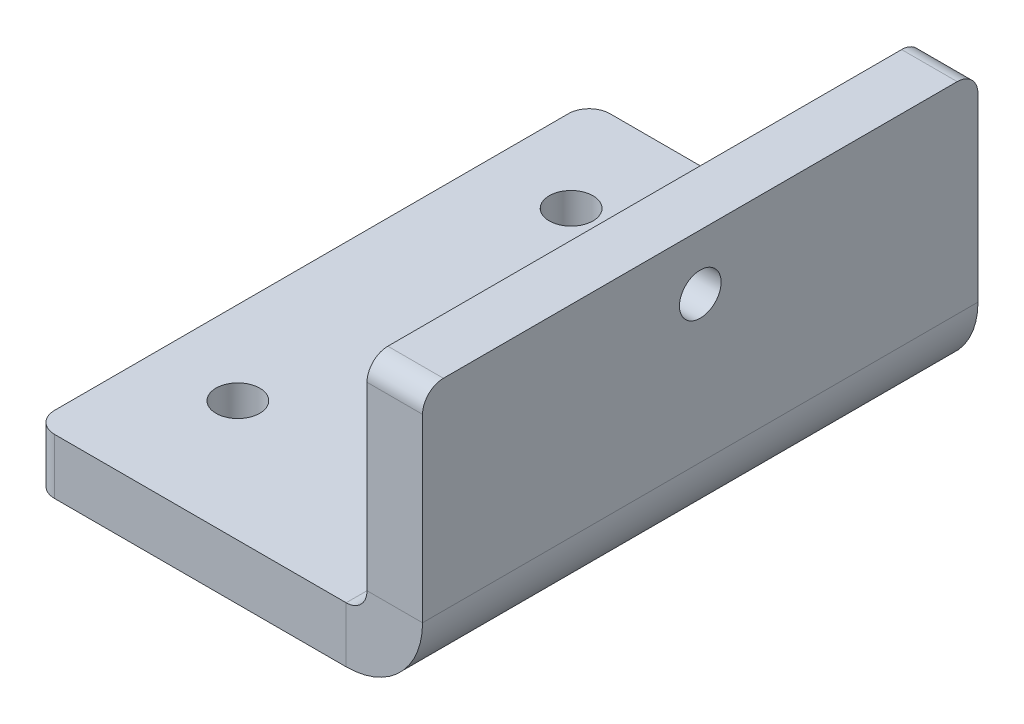
ISO-10303-21;
HEADER;
FILE_DESCRIPTION(('STEP AP214'),'2;1');
FILE_NAME('part.step','',(''),(''),'','','');
FILE_SCHEMA(('AUTOMOTIVE_DESIGN { 1 0 10303 214 1 1 1 1 }'));
ENDSEC;
DATA;
#1=APPLICATION_CONTEXT('core data for automotive mechanical design processes');
#2=APPLICATION_PROTOCOL_DEFINITION('international standard','automotive_design',2000,#1);
#3=PRODUCT_CONTEXT('',#1,'mechanical');
#4=PRODUCT('Part','Part','',(#3));
#5=PRODUCT_RELATED_PRODUCT_CATEGORY('part','',(#4));
#6=PRODUCT_DEFINITION_FORMATION('','',#4);
#7=PRODUCT_DEFINITION_CONTEXT('part definition',#1,'design');
#8=PRODUCT_DEFINITION('design','',#6,#7);
#9=PRODUCT_DEFINITION_SHAPE('','',#8);
#10=(LENGTH_UNIT() NAMED_UNIT(*) SI_UNIT(.MILLI.,.METRE.));
#11=(NAMED_UNIT(*) PLANE_ANGLE_UNIT() SI_UNIT($,.RADIAN.));
#12=(NAMED_UNIT(*) SI_UNIT($,.STERADIAN.) SOLID_ANGLE_UNIT());
#13=UNCERTAINTY_MEASURE_WITH_UNIT(LENGTH_MEASURE(1.E-05),#10,'distance_accuracy_value','');
#14=(GEOMETRIC_REPRESENTATION_CONTEXT(3) GLOBAL_UNCERTAINTY_ASSIGNED_CONTEXT((#13)) GLOBAL_UNIT_ASSIGNED_CONTEXT((#10,
#11,#12)) REPRESENTATION_CONTEXT('',''));
#15=CARTESIAN_POINT('',(0.,0.,0.));
#16=DIRECTION('',(0.,0.,1.));
#17=DIRECTION('',(1.,0.,0.));
#18=AXIS2_PLACEMENT_3D('',#15,#16,#17);
#19=CARTESIAN_POINT('',(0.,3.,40.));
#20=DIRECTION('',(0.,0.,1.));
#21=DIRECTION('',(1.,0.,0.));
#22=AXIS2_PLACEMENT_3D('',#19,#20,#21);
#23=PLANE('',#22);
#24=DIRECTION('',(1.,0.,0.));
#25=VECTOR('',#24,1.);
#26=CARTESIAN_POINT('',(0.,3.,40.));
#27=LINE('',#26,#25);
#28=CARTESIAN_POINT('',(0.,3.,40.));
#29=VERTEX_POINT('',#28);
#30=CARTESIAN_POINT('',(8.,3.,40.));
#31=VERTEX_POINT('',#30);
#32=EDGE_CURVE('E132',#29,#31,#27,.T.);
#33=ORIENTED_EDGE('',*,*,#32,.F.);
#34=CARTESIAN_POINT('',(-3.,3.,40.));
#35=DIRECTION('',(0.,0.,-1.));
#36=DIRECTION('',(-1.,0.,0.));
#37=AXIS2_PLACEMENT_3D('',#34,#35,#36);
#38=CIRCLE('',#37,3.);
#39=CARTESIAN_POINT('',(-3.,0.,40.));
#40=VERTEX_POINT('',#39);
#41=EDGE_CURVE('E136',#40,#29,#38,.F.);
#42=ORIENTED_EDGE('',*,*,#41,.F.);
#43=DIRECTION('',(0.,1.,0.));
#44=VECTOR('',#43,1.);
#45=CARTESIAN_POINT('',(-3.,-8.,40.));
#46=LINE('',#45,#44);
#47=CARTESIAN_POINT('',(-3.,-8.,40.));
#48=VERTEX_POINT('',#47);
#49=EDGE_CURVE('E141',#48,#40,#46,.T.);
#50=ORIENTED_EDGE('',*,*,#49,.F.);
#51=CARTESIAN_POINT('',(-3.,3.,40.));
#52=DIRECTION('',(0.,0.,1.));
#53=DIRECTION('',(1.,0.,0.));
#54=AXIS2_PLACEMENT_3D('',#51,#52,#53);
#55=CIRCLE('',#54,11.);
#56=EDGE_CURVE('E138',#48,#31,#55,.T.);
#57=ORIENTED_EDGE('',*,*,#56,.T.);
#58=EDGE_LOOP('',(#33,#42,#50,#57));
#59=FACE_BOUND('',#58,.T.);
#60=ADVANCED_FACE('F39',(#59),#23,.T.);
#61=CARTESIAN_POINT('',(-3.,-8.,40.));
#62=DIRECTION('',(0.,0.,1.));
#63=DIRECTION('',(1.,0.,0.));
#64=AXIS2_PLACEMENT_3D('',#61,#62,#63);
#65=PLANE('',#64);
#66=DIRECTION('',(0.,1.,0.));
#67=VECTOR('',#66,1.);
#68=CARTESIAN_POINT('',(8.,0.,40.));
#69=LINE('',#68,#67);
#70=CARTESIAN_POINT('',(8.,29.,40.));
#71=VERTEX_POINT('',#70);
#72=EDGE_CURVE('E159',#31,#71,#69,.T.);
#73=ORIENTED_EDGE('',*,*,#72,.T.);
#74=DIRECTION('',(1.,0.,0.));
#75=VECTOR('',#74,1.);
#76=CARTESIAN_POINT('',(-3.,29.,40.));
#77=LINE('',#76,#75);
#78=CARTESIAN_POINT('',(0.,29.,40.));
#79=VERTEX_POINT('',#78);
#80=EDGE_CURVE('E11',#71,#79,#77,.F.);
#81=ORIENTED_EDGE('',*,*,#80,.T.);
#82=DIRECTION('',(0.,1.,0.));
#83=VECTOR('',#82,1.);
#84=CARTESIAN_POINT('',(0.,0.,40.));
#85=LINE('',#84,#83);
#86=EDGE_CURVE('E148',#29,#79,#85,.T.);
#87=ORIENTED_EDGE('',*,*,#86,.F.);
#88=ORIENTED_EDGE('',*,*,#32,.T.);
#89=EDGE_LOOP('',(#73,#81,#87,#88));
#90=FACE_BOUND('',#89,.T.);
#91=ADVANCED_FACE('F158',(#90),#65,.T.);
#92=CARTESIAN_POINT('',(-3.,0.,-40.));
#93=DIRECTION('',(0.,0.,-1.));
#94=DIRECTION('',(-1.,0.,0.));
#95=AXIS2_PLACEMENT_3D('',#92,#93,#94);
#96=PLANE('',#95);
#97=DIRECTION('',(0.,-1.,0.));
#98=VECTOR('',#97,1.);
#99=CARTESIAN_POINT('',(-3.,0.,-40.));
#100=LINE('',#99,#98);
#101=CARTESIAN_POINT('',(-3.,0.,-40.));
#102=VERTEX_POINT('',#101);
#103=CARTESIAN_POINT('',(-3.,-8.,-40.));
#104=VERTEX_POINT('',#103);
#105=EDGE_CURVE('E203',#102,#104,#100,.T.);
#106=ORIENTED_EDGE('',*,*,#105,.F.);
#107=CARTESIAN_POINT('',(-3.,3.,-40.));
#108=DIRECTION('',(0.,0.,-1.));
#109=DIRECTION('',(-1.,0.,0.));
#110=AXIS2_PLACEMENT_3D('',#107,#108,#109);
#111=CIRCLE('',#110,3.);
#112=CARTESIAN_POINT('',(0.,3.,-40.));
#113=VERTEX_POINT('',#112);
#114=EDGE_CURVE('E177',#102,#113,#111,.F.);
#115=ORIENTED_EDGE('',*,*,#114,.T.);
#116=DIRECTION('',(-1.,0.,0.));
#117=VECTOR('',#116,1.);
#118=CARTESIAN_POINT('',(8.,3.,-40.));
#119=LINE('',#118,#117);
#120=CARTESIAN_POINT('',(8.,3.,-40.));
#121=VERTEX_POINT('',#120);
#122=EDGE_CURVE('E201',#121,#113,#119,.T.);
#123=ORIENTED_EDGE('',*,*,#122,.F.);
#124=CARTESIAN_POINT('',(-3.,3.,-40.));
#125=DIRECTION('',(0.,0.,1.));
#126=DIRECTION('',(1.,0.,0.));
#127=AXIS2_PLACEMENT_3D('',#124,#125,#126);
#128=CIRCLE('',#127,11.);
#129=EDGE_CURVE('E183',#104,#121,#128,.T.);
#130=ORIENTED_EDGE('',*,*,#129,.F.);
#131=EDGE_LOOP('',(#106,#115,#123,#130));
#132=FACE_BOUND('',#131,.T.);
#133=ADVANCED_FACE('F271',(#132),#96,.T.);
#134=CARTESIAN_POINT('',(8.,3.,-40.));
#135=DIRECTION('',(0.,0.,-1.));
#136=DIRECTION('',(-1.,0.,0.));
#137=AXIS2_PLACEMENT_3D('',#134,#135,#136);
#138=PLANE('',#137);
#139=DIRECTION('',(1.,0.,0.));
#140=VECTOR('',#139,1.);
#141=CARTESIAN_POINT('',(-48.,-8.,-40.));
#142=LINE('',#141,#140);
#143=CARTESIAN_POINT('',(-45.,-8.,-40.));
#144=VERTEX_POINT('',#143);
#145=EDGE_CURVE('E181',#144,#104,#142,.T.);
#146=ORIENTED_EDGE('',*,*,#145,.F.);
#147=DIRECTION('',(0.,1.,0.));
#148=VECTOR('',#147,1.);
#149=CARTESIAN_POINT('',(-45.,3.,-40.));
#150=LINE('',#149,#148);
#151=CARTESIAN_POINT('',(-45.,0.,-40.));
#152=VERTEX_POINT('',#151);
#153=EDGE_CURVE('E222',#144,#152,#150,.T.);
#154=ORIENTED_EDGE('',*,*,#153,.T.);
#155=DIRECTION('',(1.,0.,0.));
#156=VECTOR('',#155,1.);
#157=CARTESIAN_POINT('',(-48.,0.,-40.));
#158=LINE('',#157,#156);
#159=EDGE_CURVE('E179',#152,#102,#158,.T.);
#160=ORIENTED_EDGE('',*,*,#159,.T.);
#161=ORIENTED_EDGE('',*,*,#105,.T.);
#162=EDGE_LOOP('',(#146,#154,#160,#161));
#163=FACE_BOUND('',#162,.T.);
#164=ADVANCED_FACE('F283',(#163),#138,.T.);
#165=CARTESIAN_POINT('',(8.,0.,40.));
#166=DIRECTION('',(-1.,0.,0.));
#167=DIRECTION('',(0.,0.,1.));
#168=AXIS2_PLACEMENT_3D('',#165,#166,#167);
#169=PLANE('',#168);
#170=CARTESIAN_POINT('',(8.,24.,0.));
#171=DIRECTION('',(-1.,0.,0.));
#172=DIRECTION('',(0.,0.,1.));
#173=AXIS2_PLACEMENT_3D('',#170,#171,#172);
#174=CIRCLE('',#173,3.);
#175=CARTESIAN_POINT('',(8.,24.,3.));
#176=VERTEX_POINT('',#175);
#177=EDGE_CURVE('E250',#176,#176,#174,.T.);
#178=ORIENTED_EDGE('',*,*,#177,.T.);
#179=EDGE_LOOP('',(#178));
#180=FACE_BOUND('',#179,.T.);
#181=DIRECTION('',(0.,1.,0.));
#182=VECTOR('',#181,1.);
#183=CARTESIAN_POINT('',(8.,0.,-40.));
#184=LINE('',#183,#182);
#185=CARTESIAN_POINT('',(8.,29.,-40.));
#186=VERTEX_POINT('',#185);
#187=EDGE_CURVE('E173',#121,#186,#184,.T.);
#188=ORIENTED_EDGE('',*,*,#187,.T.);
#189=CARTESIAN_POINT('',(8.,29.,-37.));
#190=DIRECTION('',(-1.,0.,0.));
#191=DIRECTION('',(0.,0.,1.));
#192=AXIS2_PLACEMENT_3D('',#189,#190,#191);
#193=CIRCLE('',#192,3.);
#194=CARTESIAN_POINT('',(8.,32.,-37.));
#195=VERTEX_POINT('',#194);
#196=EDGE_CURVE('E230',#186,#195,#193,.F.);
#197=ORIENTED_EDGE('',*,*,#196,.T.);
#198=DIRECTION('',(0.,0.,-1.));
#199=VECTOR('',#198,1.);
#200=CARTESIAN_POINT('',(8.,32.,40.));
#201=LINE('',#200,#199);
#202=CARTESIAN_POINT('',(8.,32.,37.));
#203=VERTEX_POINT('',#202);
#204=EDGE_CURVE('E199',#203,#195,#201,.T.);
#205=ORIENTED_EDGE('',*,*,#204,.F.);
#206=CARTESIAN_POINT('',(8.,29.,37.));
#207=DIRECTION('',(-1.,0.,0.));
#208=DIRECTION('',(0.,0.,1.));
#209=AXIS2_PLACEMENT_3D('',#206,#207,#208);
#210=CIRCLE('',#209,3.);
#211=EDGE_CURVE('E228',#203,#71,#210,.F.);
#212=ORIENTED_EDGE('',*,*,#211,.T.);
#213=ORIENTED_EDGE('',*,*,#72,.F.);
#214=DIRECTION('',(0.,0.,-1.));
#215=VECTOR('',#214,1.);
#216=CARTESIAN_POINT('',(8.,3.,40.));
#217=LINE('',#216,#215);
#218=EDGE_CURVE('E172',#31,#121,#217,.T.);
#219=ORIENTED_EDGE('',*,*,#218,.T.);
#220=EDGE_LOOP('',(#188,#197,#205,#212,#213,#219));
#221=FACE_BOUND('',#220,.T.);
#222=ADVANCED_FACE('F261',(#180,#221),#169,.F.);
#223=CARTESIAN_POINT('',(0.,32.,40.));
#224=DIRECTION('',(0.,1.,0.));
#225=DIRECTION('',(0.,0.,1.));
#226=AXIS2_PLACEMENT_3D('',#223,#224,#225);
#227=PLANE('',#226);
#228=ORIENTED_EDGE('',*,*,#204,.T.);
#229=DIRECTION('',(1.,0.,0.));
#230=VECTOR('',#229,1.);
#231=CARTESIAN_POINT('',(0.,32.,-37.));
#232=LINE('',#231,#230);
#233=CARTESIAN_POINT('',(0.,32.,-37.));
#234=VERTEX_POINT('',#233);
#235=EDGE_CURVE('E62',#195,#234,#232,.F.);
#236=ORIENTED_EDGE('',*,*,#235,.T.);
#237=DIRECTION('',(0.,0.,-1.));
#238=VECTOR('',#237,1.);
#239=CARTESIAN_POINT('',(0.,32.,40.));
#240=LINE('',#239,#238);
#241=CARTESIAN_POINT('',(0.,32.,37.));
#242=VERTEX_POINT('',#241);
#243=EDGE_CURVE('E155',#242,#234,#240,.T.);
#244=ORIENTED_EDGE('',*,*,#243,.F.);
#245=DIRECTION('',(1.,0.,0.));
#246=VECTOR('',#245,1.);
#247=CARTESIAN_POINT('',(0.,32.,37.));
#248=LINE('',#247,#246);
#249=EDGE_CURVE('E232',#242,#203,#248,.T.);
#250=ORIENTED_EDGE('',*,*,#249,.T.);
#251=EDGE_LOOP('',(#228,#236,#244,#250));
#252=FACE_BOUND('',#251,.T.);
#253=ADVANCED_FACE('F259',(#252),#227,.T.);
#254=CARTESIAN_POINT('',(0.,0.,40.));
#255=DIRECTION('',(-1.,0.,0.));
#256=DIRECTION('',(0.,0.,1.));
#257=AXIS2_PLACEMENT_3D('',#254,#255,#256);
#258=PLANE('',#257);
#259=CARTESIAN_POINT('',(0.,24.,0.));
#260=DIRECTION('',(-1.,0.,0.));
#261=DIRECTION('',(0.,0.,1.));
#262=AXIS2_PLACEMENT_3D('',#259,#260,#261);
#263=CIRCLE('',#262,3.);
#264=CARTESIAN_POINT('',(0.,24.,3.));
#265=VERTEX_POINT('',#264);
#266=EDGE_CURVE('E358',#265,#265,#263,.T.);
#267=ORIENTED_EDGE('',*,*,#266,.F.);
#268=EDGE_LOOP('',(#267));
#269=FACE_BOUND('',#268,.T.);
#270=ORIENTED_EDGE('',*,*,#243,.T.);
#271=CARTESIAN_POINT('',(0.,29.,-37.));
#272=DIRECTION('',(-1.,0.,0.));
#273=DIRECTION('',(0.,0.,1.));
#274=AXIS2_PLACEMENT_3D('',#271,#272,#273);
#275=CIRCLE('',#274,3.);
#276=CARTESIAN_POINT('',(0.,29.,-40.));
#277=VERTEX_POINT('',#276);
#278=EDGE_CURVE('E48',#234,#277,#275,.T.);
#279=ORIENTED_EDGE('',*,*,#278,.T.);
#280=DIRECTION('',(0.,1.,0.));
#281=VECTOR('',#280,1.);
#282=CARTESIAN_POINT('',(0.,0.,-40.));
#283=LINE('',#282,#281);
#284=EDGE_CURVE('E151',#113,#277,#283,.T.);
#285=ORIENTED_EDGE('',*,*,#284,.F.);
#286=DIRECTION('',(0.,0.,-1.));
#287=VECTOR('',#286,1.);
#288=CARTESIAN_POINT('',(0.,3.,40.));
#289=LINE('',#288,#287);
#290=EDGE_CURVE('E146',#29,#113,#289,.T.);
#291=ORIENTED_EDGE('',*,*,#290,.F.);
#292=ORIENTED_EDGE('',*,*,#86,.T.);
#293=CARTESIAN_POINT('',(0.,29.,37.));
#294=DIRECTION('',(-1.,0.,0.));
#295=DIRECTION('',(0.,0.,1.));
#296=AXIS2_PLACEMENT_3D('',#293,#294,#295);
#297=CIRCLE('',#296,3.);
#298=EDGE_CURVE('E236',#79,#242,#297,.T.);
#299=ORIENTED_EDGE('',*,*,#298,.T.);
#300=EDGE_LOOP('',(#270,#279,#285,#291,#292,#299));
#301=FACE_BOUND('',#300,.T.);
#302=ADVANCED_FACE('F147',(#269,#301),#258,.T.);
#303=CARTESIAN_POINT('',(-3.,3.,40.));
#304=DIRECTION('',(0.,0.,-1.));
#305=DIRECTION('',(-1.,0.,0.));
#306=AXIS2_PLACEMENT_3D('',#303,#304,#305);
#307=CYLINDRICAL_SURFACE('',#306,3.);
#308=ORIENTED_EDGE('',*,*,#114,.F.);
#309=DIRECTION('',(0.,0.,-1.));
#310=VECTOR('',#309,1.);
#311=CARTESIAN_POINT('',(-3.,0.,40.));
#312=LINE('',#311,#310);
#313=EDGE_CURVE('E156',#40,#102,#312,.T.);
#314=ORIENTED_EDGE('',*,*,#313,.F.);
#315=ORIENTED_EDGE('',*,*,#41,.T.);
#316=ORIENTED_EDGE('',*,*,#290,.T.);
#317=EDGE_LOOP('',(#308,#314,#315,#316));
#318=FACE_BOUND('',#317,.T.);
#319=ADVANCED_FACE('F162',(#318),#307,.F.);
#320=CARTESIAN_POINT('',(-48.,0.,40.));
#321=DIRECTION('',(0.,1.,0.));
#322=DIRECTION('',(0.,0.,1.));
#323=AXIS2_PLACEMENT_3D('',#320,#321,#322);
#324=PLANE('',#323);
#325=CARTESIAN_POINT('',(-36.,0.,-25.3976815907645));
#326=DIRECTION('',(0.,1.,0.));
#327=DIRECTION('',(0.,0.,1.));
#328=AXIS2_PLACEMENT_3D('',#325,#326,#327);
#329=CIRCLE('',#328,3.15);
#330=CARTESIAN_POINT('',(-36.,0.,-22.2476815907645));
#331=VERTEX_POINT('',#330);
#332=EDGE_CURVE('E240',#331,#331,#329,.T.);
#333=ORIENTED_EDGE('',*,*,#332,.F.);
#334=EDGE_LOOP('',(#333));
#335=FACE_BOUND('',#334,.T.);
#336=CARTESIAN_POINT('',(-36.,0.,22.6023184092355));
#337=DIRECTION('',(0.,1.,0.));
#338=DIRECTION('',(0.,0.,-1.));
#339=AXIS2_PLACEMENT_3D('',#336,#337,#338);
#340=CIRCLE('',#339,3.15);
#341=CARTESIAN_POINT('',(-36.,0.,19.4523184092355));
#342=VERTEX_POINT('',#341);
#343=EDGE_CURVE('E245',#342,#342,#340,.T.);
#344=ORIENTED_EDGE('',*,*,#343,.F.);
#345=EDGE_LOOP('',(#344));
#346=FACE_BOUND('',#345,.T.);
#347=DIRECTION('',(0.,0.,-1.));
#348=VECTOR('',#347,1.);
#349=CARTESIAN_POINT('',(-48.,0.,40.));
#350=LINE('',#349,#348);
#351=CARTESIAN_POINT('',(-48.,0.,37.));
#352=VERTEX_POINT('',#351);
#353=CARTESIAN_POINT('',(-48.,0.,-37.));
#354=VERTEX_POINT('',#353);
#355=EDGE_CURVE('E194',#352,#354,#350,.T.);
#356=ORIENTED_EDGE('',*,*,#355,.F.);
#357=CARTESIAN_POINT('',(-45.,0.,37.));
#358=DIRECTION('',(0.,1.,0.));
#359=DIRECTION('',(0.,0.,1.));
#360=AXIS2_PLACEMENT_3D('',#357,#358,#359);
#361=CIRCLE('',#360,3.);
#362=CARTESIAN_POINT('',(-45.,0.,40.));
#363=VERTEX_POINT('',#362);
#364=EDGE_CURVE('E214',#352,#363,#361,.T.);
#365=ORIENTED_EDGE('',*,*,#364,.T.);
#366=DIRECTION('',(1.,0.,0.));
#367=VECTOR('',#366,1.);
#368=CARTESIAN_POINT('',(-48.,0.,40.));
#369=LINE('',#368,#367);
#370=EDGE_CURVE('E164',#363,#40,#369,.T.);
#371=ORIENTED_EDGE('',*,*,#370,.T.);
#372=ORIENTED_EDGE('',*,*,#313,.T.);
#373=ORIENTED_EDGE('',*,*,#159,.F.);
#374=CARTESIAN_POINT('',(-45.,0.,-37.));
#375=DIRECTION('',(0.,1.,0.));
#376=DIRECTION('',(0.,0.,1.));
#377=AXIS2_PLACEMENT_3D('',#374,#375,#376);
#378=CIRCLE('',#377,3.);
#379=EDGE_CURVE('E212',#152,#354,#378,.T.);
#380=ORIENTED_EDGE('',*,*,#379,.T.);
#381=EDGE_LOOP('',(#356,#365,#371,#372,#373,#380));
#382=FACE_BOUND('',#381,.T.);
#383=ADVANCED_FACE('F287',(#335,#346,#382),#324,.T.);
#384=CARTESIAN_POINT('',(-48.,-8.,40.));
#385=DIRECTION('',(-1.,0.,0.));
#386=DIRECTION('',(0.,0.,1.));
#387=AXIS2_PLACEMENT_3D('',#384,#385,#386);
#388=PLANE('',#387);
#389=DIRECTION('',(0.,0.,-1.));
#390=VECTOR('',#389,1.);
#391=CARTESIAN_POINT('',(-48.,-8.,40.));
#392=LINE('',#391,#390);
#393=CARTESIAN_POINT('',(-48.,-8.,37.));
#394=VERTEX_POINT('',#393);
#395=CARTESIAN_POINT('',(-48.,-8.,-37.));
#396=VERTEX_POINT('',#395);
#397=EDGE_CURVE('E191',#394,#396,#392,.T.);
#398=ORIENTED_EDGE('',*,*,#397,.F.);
#399=DIRECTION('',(0.,1.,0.));
#400=VECTOR('',#399,1.);
#401=CARTESIAN_POINT('',(-48.,0.,37.));
#402=LINE('',#401,#400);
#403=EDGE_CURVE('E209',#394,#352,#402,.T.);
#404=ORIENTED_EDGE('',*,*,#403,.T.);
#405=ORIENTED_EDGE('',*,*,#355,.T.);
#406=DIRECTION('',(0.,1.,0.));
#407=VECTOR('',#406,1.);
#408=CARTESIAN_POINT('',(-48.,-8.,-37.));
#409=LINE('',#408,#407);
#410=EDGE_CURVE('E140',#354,#396,#409,.F.);
#411=ORIENTED_EDGE('',*,*,#410,.T.);
#412=EDGE_LOOP('',(#398,#404,#405,#411));
#413=FACE_BOUND('',#412,.T.);
#414=ADVANCED_FACE('F297',(#413),#388,.T.);
#415=CARTESIAN_POINT('',(-48.,-8.,40.));
#416=DIRECTION('',(0.,1.,0.));
#417=DIRECTION('',(0.,0.,1.));
#418=AXIS2_PLACEMENT_3D('',#415,#416,#417);
#419=PLANE('',#418);
#420=CARTESIAN_POINT('',(-36.,-8.,-25.3976815907645));
#421=DIRECTION('',(0.,1.,0.));
#422=DIRECTION('',(0.,0.,1.));
#423=AXIS2_PLACEMENT_3D('',#420,#421,#422);
#424=CIRCLE('',#423,3.15);
#425=CARTESIAN_POINT('',(-36.,-8.,-22.2476815907645));
#426=VERTEX_POINT('',#425);
#427=EDGE_CURVE('E43',#426,#426,#424,.T.);
#428=ORIENTED_EDGE('',*,*,#427,.T.);
#429=EDGE_LOOP('',(#428));
#430=FACE_BOUND('',#429,.T.);
#431=CARTESIAN_POINT('',(-36.,-8.,22.6023184092355));
#432=DIRECTION('',(0.,1.,0.));
#433=DIRECTION('',(0.,0.,1.));
#434=AXIS2_PLACEMENT_3D('',#431,#432,#433);
#435=CIRCLE('',#434,3.15);
#436=CARTESIAN_POINT('',(-36.,-8.,25.7523184092355));
#437=VERTEX_POINT('',#436);
#438=EDGE_CURVE('E238',#437,#437,#435,.T.);
#439=ORIENTED_EDGE('',*,*,#438,.T.);
#440=EDGE_LOOP('',(#439));
#441=FACE_BOUND('',#440,.T.);
#442=DIRECTION('',(1.,0.,0.));
#443=VECTOR('',#442,1.);
#444=CARTESIAN_POINT('',(-48.,-8.,40.));
#445=LINE('',#444,#443);
#446=CARTESIAN_POINT('',(-45.,-8.,40.));
#447=VERTEX_POINT('',#446);
#448=EDGE_CURVE('E166',#447,#48,#445,.T.);
#449=ORIENTED_EDGE('',*,*,#448,.F.);
#450=CARTESIAN_POINT('',(-45.,-8.,37.));
#451=DIRECTION('',(0.,1.,0.));
#452=DIRECTION('',(0.,0.,1.));
#453=AXIS2_PLACEMENT_3D('',#450,#451,#452);
#454=CIRCLE('',#453,3.);
#455=EDGE_CURVE('E220',#447,#394,#454,.F.);
#456=ORIENTED_EDGE('',*,*,#455,.T.);
#457=ORIENTED_EDGE('',*,*,#397,.T.);
#458=CARTESIAN_POINT('',(-45.,-8.,-37.));
#459=DIRECTION('',(0.,1.,0.));
#460=DIRECTION('',(0.,0.,1.));
#461=AXIS2_PLACEMENT_3D('',#458,#459,#460);
#462=CIRCLE('',#461,3.);
#463=EDGE_CURVE('E218',#396,#144,#462,.F.);
#464=ORIENTED_EDGE('',*,*,#463,.T.);
#465=ORIENTED_EDGE('',*,*,#145,.T.);
#466=DIRECTION('',(0.,0.,-1.));
#467=VECTOR('',#466,1.);
#468=CARTESIAN_POINT('',(-3.,-8.,40.));
#469=LINE('',#468,#467);
#470=EDGE_CURVE('E188',#48,#104,#469,.T.);
#471=ORIENTED_EDGE('',*,*,#470,.F.);
#472=EDGE_LOOP('',(#449,#456,#457,#464,#465,#471));
#473=FACE_BOUND('',#472,.T.);
#474=ADVANCED_FACE('F277',(#430,#441,#473),#419,.F.);
#475=CARTESIAN_POINT('',(-3.,3.,40.));
#476=DIRECTION('',(0.,0.,-1.));
#477=DIRECTION('',(-1.,0.,0.));
#478=AXIS2_PLACEMENT_3D('',#475,#476,#477);
#479=CYLINDRICAL_SURFACE('',#478,11.);
#480=ORIENTED_EDGE('',*,*,#129,.T.);
#481=ORIENTED_EDGE('',*,*,#218,.F.);
#482=ORIENTED_EDGE('',*,*,#56,.F.);
#483=ORIENTED_EDGE('',*,*,#470,.T.);
#484=EDGE_LOOP('',(#480,#481,#482,#483));
#485=FACE_BOUND('',#484,.T.);
#486=ADVANCED_FACE('F273',(#485),#479,.T.);
#487=CARTESIAN_POINT('',(-3.,3.,40.));
#488=DIRECTION('',(0.,0.,-1.));
#489=DIRECTION('',(-1.,0.,0.));
#490=AXIS2_PLACEMENT_3D('',#487,#488,#489);
#491=PLANE('',#490);
#492=ORIENTED_EDGE('',*,*,#370,.F.);
#493=DIRECTION('',(0.,1.,0.));
#494=VECTOR('',#493,1.);
#495=CARTESIAN_POINT('',(-45.,-8.,40.));
#496=LINE('',#495,#494);
#497=EDGE_CURVE('E216',#363,#447,#496,.F.);
#498=ORIENTED_EDGE('',*,*,#497,.T.);
#499=ORIENTED_EDGE('',*,*,#448,.T.);
#500=ORIENTED_EDGE('',*,*,#49,.T.);
#501=EDGE_LOOP('',(#492,#498,#499,#500));
#502=FACE_BOUND('',#501,.T.);
#503=ADVANCED_FACE('F291',(#502),#491,.F.);
#504=CARTESIAN_POINT('',(-3.,3.,-40.));
#505=DIRECTION('',(0.,0.,-1.));
#506=DIRECTION('',(-1.,0.,0.));
#507=AXIS2_PLACEMENT_3D('',#504,#505,#506);
#508=PLANE('',#507);
#509=ORIENTED_EDGE('',*,*,#284,.T.);
#510=DIRECTION('',(1.,0.,0.));
#511=VECTOR('',#510,1.);
#512=CARTESIAN_POINT('',(-3.,29.,-40.));
#513=LINE('',#512,#511);
#514=EDGE_CURVE('E225',#277,#186,#513,.T.);
#515=ORIENTED_EDGE('',*,*,#514,.T.);
#516=ORIENTED_EDGE('',*,*,#187,.F.);
#517=ORIENTED_EDGE('',*,*,#122,.T.);
#518=EDGE_LOOP('',(#509,#515,#516,#517));
#519=FACE_BOUND('',#518,.T.);
#520=ADVANCED_FACE('F267',(#519),#508,.T.);
#521=CARTESIAN_POINT('',(-45.,-8.,37.));
#522=DIRECTION('',(0.,-1.,0.));
#523=DIRECTION('',(0.,0.,-1.));
#524=AXIS2_PLACEMENT_3D('',#521,#522,#523);
#525=CYLINDRICAL_SURFACE('',#524,3.);
#526=ORIENTED_EDGE('',*,*,#455,.F.);
#527=ORIENTED_EDGE('',*,*,#497,.F.);
#528=ORIENTED_EDGE('',*,*,#364,.F.);
#529=ORIENTED_EDGE('',*,*,#403,.F.);
#530=EDGE_LOOP('',(#526,#527,#528,#529));
#531=FACE_BOUND('',#530,.T.);
#532=ADVANCED_FACE('F293',(#531),#525,.T.);
#533=CARTESIAN_POINT('',(-45.,3.,-37.));
#534=DIRECTION('',(0.,1.,0.));
#535=DIRECTION('',(0.,0.,1.));
#536=AXIS2_PLACEMENT_3D('',#533,#534,#535);
#537=CYLINDRICAL_SURFACE('',#536,3.);
#538=ORIENTED_EDGE('',*,*,#463,.F.);
#539=ORIENTED_EDGE('',*,*,#410,.F.);
#540=ORIENTED_EDGE('',*,*,#379,.F.);
#541=ORIENTED_EDGE('',*,*,#153,.F.);
#542=EDGE_LOOP('',(#538,#539,#540,#541));
#543=FACE_BOUND('',#542,.T.);
#544=ADVANCED_FACE('F300',(#543),#537,.T.);
#545=CARTESIAN_POINT('',(-3.,29.,-37.));
#546=DIRECTION('',(1.,0.,0.));
#547=DIRECTION('',(0.,0.,-1.));
#548=AXIS2_PLACEMENT_3D('',#545,#546,#547);
#549=CYLINDRICAL_SURFACE('',#548,3.);
#550=ORIENTED_EDGE('',*,*,#278,.F.);
#551=ORIENTED_EDGE('',*,*,#235,.F.);
#552=ORIENTED_EDGE('',*,*,#196,.F.);
#553=ORIENTED_EDGE('',*,*,#514,.F.);
#554=EDGE_LOOP('',(#550,#551,#552,#553));
#555=FACE_BOUND('',#554,.T.);
#556=ADVANCED_FACE('F265',(#555),#549,.T.);
#557=CARTESIAN_POINT('',(0.,29.,37.));
#558=DIRECTION('',(1.,0.,0.));
#559=DIRECTION('',(0.,0.,-1.));
#560=AXIS2_PLACEMENT_3D('',#557,#558,#559);
#561=CYLINDRICAL_SURFACE('',#560,3.);
#562=ORIENTED_EDGE('',*,*,#298,.F.);
#563=ORIENTED_EDGE('',*,*,#80,.F.);
#564=ORIENTED_EDGE('',*,*,#211,.F.);
#565=ORIENTED_EDGE('',*,*,#249,.F.);
#566=EDGE_LOOP('',(#562,#563,#564,#565));
#567=FACE_BOUND('',#566,.T.);
#568=ADVANCED_FACE('F41',(#567),#561,.T.);
#569=CARTESIAN_POINT('',(-36.,-10.,22.6023184092355));
#570=DIRECTION('',(0.,1.,0.));
#571=DIRECTION('',(0.,0.,1.));
#572=AXIS2_PLACEMENT_3D('',#569,#570,#571);
#573=CYLINDRICAL_SURFACE('',#572,3.15);
#574=ORIENTED_EDGE('',*,*,#343,.T.);
#575=EDGE_LOOP('',(#574));
#576=FACE_BOUND('',#575,.T.);
#577=ORIENTED_EDGE('',*,*,#438,.F.);
#578=EDGE_LOOP('',(#577));
#579=FACE_BOUND('',#578,.T.);
#580=ADVANCED_FACE('F343',(#576,#579),#573,.F.);
#581=CARTESIAN_POINT('',(-36.,-10.,-25.3976815907645));
#582=DIRECTION('',(0.,1.,0.));
#583=DIRECTION('',(0.,0.,1.));
#584=AXIS2_PLACEMENT_3D('',#581,#582,#583);
#585=CYLINDRICAL_SURFACE('',#584,3.15);
#586=ORIENTED_EDGE('',*,*,#332,.T.);
#587=EDGE_LOOP('',(#586));
#588=FACE_BOUND('',#587,.T.);
#589=ORIENTED_EDGE('',*,*,#427,.F.);
#590=EDGE_LOOP('',(#589));
#591=FACE_BOUND('',#590,.T.);
#592=ADVANCED_FACE('F346',(#588,#591),#585,.F.);
#593=CARTESIAN_POINT('',(10.,24.,0.));
#594=DIRECTION('',(-1.,0.,0.));
#595=DIRECTION('',(0.,0.,1.));
#596=AXIS2_PLACEMENT_3D('',#593,#594,#595);
#597=CYLINDRICAL_SURFACE('',#596,3.);
#598=ORIENTED_EDGE('',*,*,#266,.T.);
#599=EDGE_LOOP('',(#598));
#600=FACE_BOUND('',#599,.T.);
#601=ORIENTED_EDGE('',*,*,#177,.F.);
#602=EDGE_LOOP('',(#601));
#603=FACE_BOUND('',#602,.T.);
#604=ADVANCED_FACE('F350',(#600,#603),#597,.F.);
#605=CLOSED_SHELL('',(#60,#91,#133,#164,#222,#253,#302,#319,#383,#414,#474,#486,#503,#520,#532,
#544,#556,#568,#580,#592,#604));
#606=MANIFOLD_SOLID_BREP('B2',#605);
#607=ADVANCED_BREP_SHAPE_REPRESENTATION('',(#18,#606),#14);
#608=SHAPE_DEFINITION_REPRESENTATION(#9,#607);
ENDSEC;
END-ISO-10303-21;
